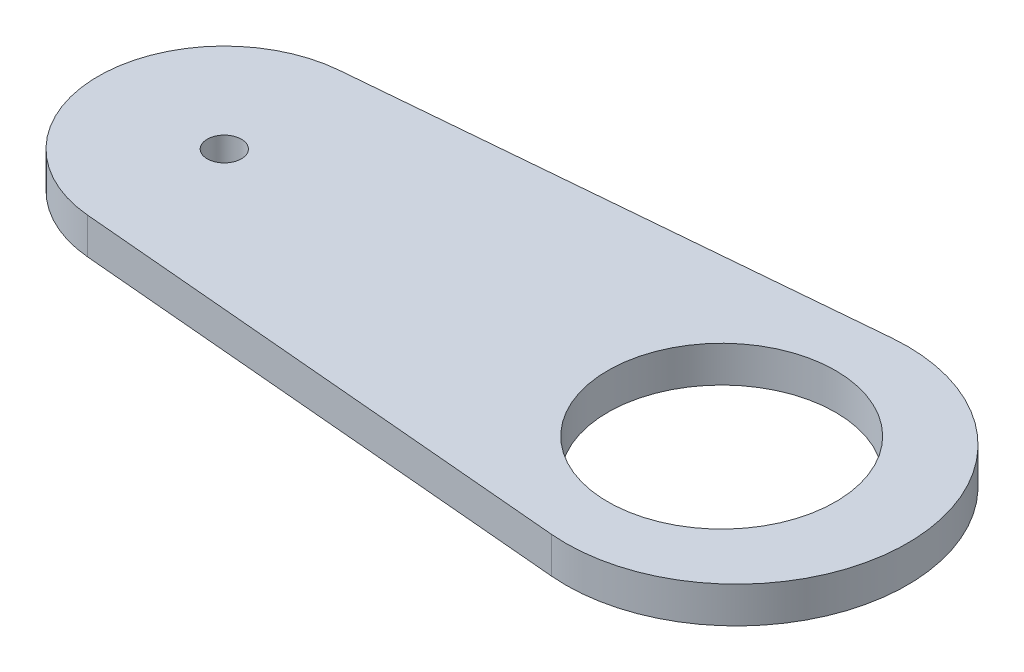
ISO-10303-21;
HEADER;
FILE_DESCRIPTION(('STEP AP214'),'2;1');
FILE_NAME('part.step','',(''),(''),'','','');
FILE_SCHEMA(('AUTOMOTIVE_DESIGN { 1 0 10303 214 1 1 1 1 }'));
ENDSEC;
DATA;
#1=APPLICATION_CONTEXT('core data for automotive mechanical design processes');
#2=APPLICATION_PROTOCOL_DEFINITION('international standard','automotive_design',2000,#1);
#3=PRODUCT_CONTEXT('',#1,'mechanical');
#4=PRODUCT('Part','Part','',(#3));
#5=PRODUCT_RELATED_PRODUCT_CATEGORY('part','',(#4));
#6=PRODUCT_DEFINITION_FORMATION('','',#4);
#7=PRODUCT_DEFINITION_CONTEXT('part definition',#1,'design');
#8=PRODUCT_DEFINITION('design','',#6,#7);
#9=PRODUCT_DEFINITION_SHAPE('','',#8);
#10=(LENGTH_UNIT() NAMED_UNIT(*) SI_UNIT(.MILLI.,.METRE.));
#11=(NAMED_UNIT(*) PLANE_ANGLE_UNIT() SI_UNIT($,.RADIAN.));
#12=(NAMED_UNIT(*) SI_UNIT($,.STERADIAN.) SOLID_ANGLE_UNIT());
#13=UNCERTAINTY_MEASURE_WITH_UNIT(LENGTH_MEASURE(1.E-05),#10,'distance_accuracy_value','');
#14=(GEOMETRIC_REPRESENTATION_CONTEXT(3) GLOBAL_UNCERTAINTY_ASSIGNED_CONTEXT((#13)) GLOBAL_UNIT_ASSIGNED_CONTEXT((#10,
#11,#12)) REPRESENTATION_CONTEXT('',''));
#15=CARTESIAN_POINT('',(0.,0.,0.));
#16=DIRECTION('',(0.,0.,1.));
#17=DIRECTION('',(1.,0.,0.));
#18=AXIS2_PLACEMENT_3D('',#15,#16,#17);
#19=CARTESIAN_POINT('',(-35.984778004175,3.18,0.));
#20=DIRECTION('',(0.,1.,0.));
#21=DIRECTION('',(0.,0.,1.));
#22=AXIS2_PLACEMENT_3D('',#19,#20,#21);
#23=PLANE('',#22);
#24=CARTESIAN_POINT('',(7.70788585461012,3.18,0.));
#25=DIRECTION('',(0.,-1.,0.));
#26=DIRECTION('',(0.,0.,-1.));
#27=AXIS2_PLACEMENT_3D('',#24,#25,#26);
#28=CIRCLE('',#27,10.);
#29=CARTESIAN_POINT('',(7.70788585461012,3.18,-10.));
#30=VERTEX_POINT('',#29);
#31=EDGE_CURVE('E127',#30,#30,#28,.T.);
#32=ORIENTED_EDGE('',*,*,#31,.T.);
#33=EDGE_LOOP('',(#32));
#34=FACE_BOUND('',#33,.T.);
#35=CARTESIAN_POINT('',(-35.984778004175,3.18,0.));
#36=DIRECTION('',(0.,1.,0.));
#37=DIRECTION('',(0.,0.,1.));
#38=AXIS2_PLACEMENT_3D('',#35,#36,#37);
#39=CIRCLE('',#38,11.0779915763554);
#40=CARTESIAN_POINT('',(-36.9502885881646,3.18,-11.0358364738702));
#41=VERTEX_POINT('',#40);
#42=CARTESIAN_POINT('',(-36.9502885881646,3.18,11.0358364738702));
#43=VERTEX_POINT('',#42);
#44=EDGE_CURVE('E98',#41,#43,#39,.T.);
#45=ORIENTED_EDGE('',*,*,#44,.T.);
#46=DIRECTION('',(0.996194698091746,0.,0.0871557427476583));
#47=VECTOR('',#46,1.);
#48=CARTESIAN_POINT('',(-36.9502885881646,3.18,11.0358364738702));
#49=LINE('',#48,#47);
#50=CARTESIAN_POINT('',(7.70788585461013,3.18,14.9429204713762));
#51=VERTEX_POINT('',#50);
#52=EDGE_CURVE('E90',#43,#51,#49,.T.);
#53=ORIENTED_EDGE('',*,*,#52,.T.);
#54=CARTESIAN_POINT('',(9.015221995825,3.18,0.));
#55=DIRECTION('',(0.,-1.,0.));
#56=DIRECTION('',(0.,0.,-1.));
#57=AXIS2_PLACEMENT_3D('',#54,#55,#56);
#58=CIRCLE('',#57,15.);
#59=CARTESIAN_POINT('',(7.70788585461012,3.18,-14.9429204713762));
#60=VERTEX_POINT('',#59);
#61=EDGE_CURVE('E97',#60,#51,#58,.T.);
#62=ORIENTED_EDGE('',*,*,#61,.F.);
#63=DIRECTION('',(0.996194698091746,0.,-0.0871557427476583));
#64=VECTOR('',#63,1.);
#65=CARTESIAN_POINT('',(-36.9502885881646,3.18,-11.0358364738702));
#66=LINE('',#65,#64);
#67=EDGE_CURVE('E107',#41,#60,#66,.T.);
#68=ORIENTED_EDGE('',*,*,#67,.F.);
#69=EDGE_LOOP('',(#45,#53,#62,#68));
#70=FACE_BOUND('',#69,.T.);
#71=CARTESIAN_POINT('',(-35.984778004175,3.18,0.));
#72=DIRECTION('',(0.,1.,0.));
#73=DIRECTION('',(0.,0.,1.));
#74=AXIS2_PLACEMENT_3D('',#71,#72,#73);
#75=CIRCLE('',#74,1.5);
#76=CARTESIAN_POINT('',(-35.984778004175,3.18,-1.5));
#77=VERTEX_POINT('',#76);
#78=EDGE_CURVE('E114',#77,#77,#75,.T.);
#79=ORIENTED_EDGE('',*,*,#78,.F.);
#80=EDGE_LOOP('',(#79));
#81=FACE_BOUND('',#80,.T.);
#82=ADVANCED_FACE('F48',(#34,#70,#81),#23,.T.);
#83=CARTESIAN_POINT('',(-35.984778004175,0.,0.));
#84=DIRECTION('',(0.,1.,0.));
#85=DIRECTION('',(0.,0.,1.));
#86=AXIS2_PLACEMENT_3D('',#83,#84,#85);
#87=PLANE('',#86);
#88=CARTESIAN_POINT('',(7.70788585461012,0.,0.));
#89=DIRECTION('',(0.,-1.,0.));
#90=DIRECTION('',(0.,0.,-1.));
#91=AXIS2_PLACEMENT_3D('',#88,#89,#90);
#92=CIRCLE('',#91,10.);
#93=CARTESIAN_POINT('',(7.70788585461012,0.,-10.));
#94=VERTEX_POINT('',#93);
#95=EDGE_CURVE('E130',#94,#94,#92,.T.);
#96=ORIENTED_EDGE('',*,*,#95,.F.);
#97=EDGE_LOOP('',(#96));
#98=FACE_BOUND('',#97,.T.);
#99=CARTESIAN_POINT('',(-35.984778004175,0.,0.));
#100=DIRECTION('',(0.,1.,0.));
#101=DIRECTION('',(0.,0.,1.));
#102=AXIS2_PLACEMENT_3D('',#99,#100,#101);
#103=CIRCLE('',#102,11.0779915763554);
#104=CARTESIAN_POINT('',(-36.9502885881646,0.,-11.0358364738702));
#105=VERTEX_POINT('',#104);
#106=CARTESIAN_POINT('',(-36.9502885881646,0.,11.0358364738702));
#107=VERTEX_POINT('',#106);
#108=EDGE_CURVE('E112',#105,#107,#103,.T.);
#109=ORIENTED_EDGE('',*,*,#108,.F.);
#110=DIRECTION('',(0.996194698091746,0.,-0.0871557427476583));
#111=VECTOR('',#110,1.);
#112=CARTESIAN_POINT('',(-36.9502885881646,0.,-11.0358364738702));
#113=LINE('',#112,#111);
#114=CARTESIAN_POINT('',(7.70788585461012,0.,-14.9429204713762));
#115=VERTEX_POINT('',#114);
#116=EDGE_CURVE('E118',#105,#115,#113,.T.);
#117=ORIENTED_EDGE('',*,*,#116,.T.);
#118=CARTESIAN_POINT('',(9.015221995825,0.,0.));
#119=DIRECTION('',(0.,-1.,0.));
#120=DIRECTION('',(0.,0.,-1.));
#121=AXIS2_PLACEMENT_3D('',#118,#119,#120);
#122=CIRCLE('',#121,15.);
#123=CARTESIAN_POINT('',(7.70788585461013,0.,14.9429204713762));
#124=VERTEX_POINT('',#123);
#125=EDGE_CURVE('E116',#115,#124,#122,.T.);
#126=ORIENTED_EDGE('',*,*,#125,.T.);
#127=DIRECTION('',(0.996194698091746,0.,0.0871557427476583));
#128=VECTOR('',#127,1.);
#129=CARTESIAN_POINT('',(-36.9502885881646,0.,11.0358364738702));
#130=LINE('',#129,#128);
#131=EDGE_CURVE('E103',#107,#124,#130,.T.);
#132=ORIENTED_EDGE('',*,*,#131,.F.);
#133=EDGE_LOOP('',(#109,#117,#126,#132));
#134=FACE_BOUND('',#133,.T.);
#135=CARTESIAN_POINT('',(-35.984778004175,0.,0.));
#136=DIRECTION('',(0.,1.,0.));
#137=DIRECTION('',(0.,0.,1.));
#138=AXIS2_PLACEMENT_3D('',#135,#136,#137);
#139=CIRCLE('',#138,1.5);
#140=CARTESIAN_POINT('',(-35.984778004175,0.,-1.5));
#141=VERTEX_POINT('',#140);
#142=EDGE_CURVE('E124',#141,#141,#139,.T.);
#143=ORIENTED_EDGE('',*,*,#142,.T.);
#144=EDGE_LOOP('',(#143));
#145=FACE_BOUND('',#144,.T.);
#146=ADVANCED_FACE('F144',(#98,#134,#145),#87,.F.);
#147=CARTESIAN_POINT('',(-35.984778004175,3.18,0.));
#148=DIRECTION('',(0.,-1.,0.));
#149=DIRECTION('',(0.,0.,-1.));
#150=AXIS2_PLACEMENT_3D('',#147,#148,#149);
#151=CYLINDRICAL_SURFACE('',#150,11.0779915763554);
#152=ORIENTED_EDGE('',*,*,#108,.T.);
#153=DIRECTION('',(0.,-1.,0.));
#154=VECTOR('',#153,1.);
#155=CARTESIAN_POINT('',(-36.9502885881646,3.18,11.0358364738702));
#156=LINE('',#155,#154);
#157=EDGE_CURVE('E12',#43,#107,#156,.T.);
#158=ORIENTED_EDGE('',*,*,#157,.F.);
#159=ORIENTED_EDGE('',*,*,#44,.F.);
#160=DIRECTION('',(0.,-1.,0.));
#161=VECTOR('',#160,1.);
#162=CARTESIAN_POINT('',(-36.9502885881646,3.18,-11.0358364738702));
#163=LINE('',#162,#161);
#164=EDGE_CURVE('E65',#41,#105,#163,.T.);
#165=ORIENTED_EDGE('',*,*,#164,.T.);
#166=EDGE_LOOP('',(#152,#158,#159,#165));
#167=FACE_BOUND('',#166,.T.);
#168=ADVANCED_FACE('F50',(#167),#151,.T.);
#169=CARTESIAN_POINT('',(-36.9502885881646,3.18,11.0358364738702));
#170=DIRECTION('',(0.0871557427476583,0.,-0.996194698091746));
#171=DIRECTION('',(-0.996194698091746,0.,-0.0871557427476583));
#172=AXIS2_PLACEMENT_3D('',#169,#170,#171);
#173=PLANE('',#172);
#174=ORIENTED_EDGE('',*,*,#131,.T.);
#175=DIRECTION('',(0.,-1.,0.));
#176=VECTOR('',#175,1.);
#177=CARTESIAN_POINT('',(7.70788585461013,3.18,14.9429204713762));
#178=LINE('',#177,#176);
#179=EDGE_CURVE('E57',#51,#124,#178,.T.);
#180=ORIENTED_EDGE('',*,*,#179,.F.);
#181=ORIENTED_EDGE('',*,*,#52,.F.);
#182=ORIENTED_EDGE('',*,*,#157,.T.);
#183=EDGE_LOOP('',(#174,#180,#181,#182));
#184=FACE_BOUND('',#183,.T.);
#185=ADVANCED_FACE('F102',(#184),#173,.F.);
#186=CARTESIAN_POINT('',(9.015221995825,3.18,0.));
#187=DIRECTION('',(0.,-1.,0.));
#188=DIRECTION('',(0.,0.,-1.));
#189=AXIS2_PLACEMENT_3D('',#186,#187,#188);
#190=CYLINDRICAL_SURFACE('',#189,15.);
#191=ORIENTED_EDGE('',*,*,#125,.F.);
#192=DIRECTION('',(0.,-1.,0.));
#193=VECTOR('',#192,1.);
#194=CARTESIAN_POINT('',(7.70788585461012,3.18,-14.9429204713762));
#195=LINE('',#194,#193);
#196=EDGE_CURVE('E79',#60,#115,#195,.T.);
#197=ORIENTED_EDGE('',*,*,#196,.F.);
#198=ORIENTED_EDGE('',*,*,#61,.T.);
#199=ORIENTED_EDGE('',*,*,#179,.T.);
#200=EDGE_LOOP('',(#191,#197,#198,#199));
#201=FACE_BOUND('',#200,.T.);
#202=ADVANCED_FACE('F106',(#201),#190,.T.);
#203=CARTESIAN_POINT('',(-36.9502885881646,3.18,-11.0358364738702));
#204=DIRECTION('',(-0.0871557427476583,0.,-0.996194698091746));
#205=DIRECTION('',(-0.996194698091746,0.,0.0871557427476583));
#206=AXIS2_PLACEMENT_3D('',#203,#204,#205);
#207=PLANE('',#206);
#208=ORIENTED_EDGE('',*,*,#116,.F.);
#209=ORIENTED_EDGE('',*,*,#164,.F.);
#210=ORIENTED_EDGE('',*,*,#67,.T.);
#211=ORIENTED_EDGE('',*,*,#196,.T.);
#212=EDGE_LOOP('',(#208,#209,#210,#211));
#213=FACE_BOUND('',#212,.T.);
#214=ADVANCED_FACE('F151',(#213),#207,.T.);
#215=CARTESIAN_POINT('',(-35.984778004175,3.18,0.));
#216=DIRECTION('',(0.,-1.,0.));
#217=DIRECTION('',(0.,0.,-1.));
#218=AXIS2_PLACEMENT_3D('',#215,#216,#217);
#219=CYLINDRICAL_SURFACE('',#218,1.5);
#220=CARTESIAN_POINT('',(-35.984778004175,3.18,-1.5));
#221=CARTESIAN_POINT('',(-35.984778004175,3.146875,-1.5));
#222=CARTESIAN_POINT('',(-35.984778004175,3.11375,-1.5));
#223=CARTESIAN_POINT('',(-35.984778004175,3.0475,-1.5));
#224=CARTESIAN_POINT('',(-35.984778004175,3.014375,-1.5));
#225=CARTESIAN_POINT('',(-35.984778004175,2.948125,-1.5));
#226=CARTESIAN_POINT('',(-35.984778004175,2.915,-1.5));
#227=CARTESIAN_POINT('',(-35.984778004175,2.84875,-1.5));
#228=CARTESIAN_POINT('',(-35.984778004175,2.815625,-1.5));
#229=CARTESIAN_POINT('',(-35.984778004175,2.749375,-1.5));
#230=CARTESIAN_POINT('',(-35.984778004175,2.71625,-1.5));
#231=CARTESIAN_POINT('',(-35.984778004175,2.65,-1.5));
#232=CARTESIAN_POINT('',(-35.984778004175,2.616875,-1.5));
#233=CARTESIAN_POINT('',(-35.984778004175,2.550625,-1.5));
#234=CARTESIAN_POINT('',(-35.984778004175,2.5175,-1.5));
#235=CARTESIAN_POINT('',(-35.984778004175,2.45125,-1.5));
#236=CARTESIAN_POINT('',(-35.984778004175,2.418125,-1.5));
#237=CARTESIAN_POINT('',(-35.984778004175,2.351875,-1.5));
#238=CARTESIAN_POINT('',(-35.984778004175,2.31875,-1.5));
#239=CARTESIAN_POINT('',(-35.984778004175,2.2525,-1.5));
#240=CARTESIAN_POINT('',(-35.984778004175,2.219375,-1.5));
#241=CARTESIAN_POINT('',(-35.984778004175,2.153125,-1.5));
#242=CARTESIAN_POINT('',(-35.984778004175,2.12,-1.5));
#243=CARTESIAN_POINT('',(-35.984778004175,2.05375,-1.5));
#244=CARTESIAN_POINT('',(-35.984778004175,2.020625,-1.5));
#245=CARTESIAN_POINT('',(-35.984778004175,1.954375,-1.5));
#246=CARTESIAN_POINT('',(-35.984778004175,1.92125,-1.5));
#247=CARTESIAN_POINT('',(-35.984778004175,1.855,-1.5));
#248=CARTESIAN_POINT('',(-35.984778004175,1.821875,-1.5));
#249=CARTESIAN_POINT('',(-35.984778004175,1.755625,-1.5));
#250=CARTESIAN_POINT('',(-35.984778004175,1.7225,-1.5));
#251=CARTESIAN_POINT('',(-35.984778004175,1.65625,-1.5));
#252=CARTESIAN_POINT('',(-35.984778004175,1.623125,-1.5));
#253=CARTESIAN_POINT('',(-35.984778004175,1.556875,-1.5));
#254=CARTESIAN_POINT('',(-35.984778004175,1.52375,-1.5));
#255=CARTESIAN_POINT('',(-35.984778004175,1.4575,-1.5));
#256=CARTESIAN_POINT('',(-35.984778004175,1.424375,-1.5));
#257=CARTESIAN_POINT('',(-35.984778004175,1.358125,-1.5));
#258=CARTESIAN_POINT('',(-35.984778004175,1.325,-1.5));
#259=CARTESIAN_POINT('',(-35.984778004175,1.25875,-1.5));
#260=CARTESIAN_POINT('',(-35.984778004175,1.225625,-1.5));
#261=CARTESIAN_POINT('',(-35.984778004175,1.159375,-1.5));
#262=CARTESIAN_POINT('',(-35.984778004175,1.12625,-1.5));
#263=CARTESIAN_POINT('',(-35.984778004175,1.06,-1.5));
#264=CARTESIAN_POINT('',(-35.984778004175,1.026875,-1.5));
#265=CARTESIAN_POINT('',(-35.984778004175,0.960625,-1.5));
#266=CARTESIAN_POINT('',(-35.984778004175,0.9275,-1.5));
#267=CARTESIAN_POINT('',(-35.984778004175,0.86125,-1.5));
#268=CARTESIAN_POINT('',(-35.984778004175,0.828125,-1.5));
#269=CARTESIAN_POINT('',(-35.984778004175,0.761875,-1.5));
#270=CARTESIAN_POINT('',(-35.984778004175,0.72875,-1.5));
#271=CARTESIAN_POINT('',(-35.984778004175,0.6625,-1.5));
#272=CARTESIAN_POINT('',(-35.984778004175,0.629375,-1.5));
#273=CARTESIAN_POINT('',(-35.984778004175,0.563125,-1.5));
#274=CARTESIAN_POINT('',(-35.984778004175,0.53,-1.5));
#275=CARTESIAN_POINT('',(-35.984778004175,0.46375,-1.5));
#276=CARTESIAN_POINT('',(-35.984778004175,0.430625,-1.5));
#277=CARTESIAN_POINT('',(-35.984778004175,0.364375,-1.5));
#278=CARTESIAN_POINT('',(-35.984778004175,0.33125,-1.5));
#279=CARTESIAN_POINT('',(-35.984778004175,0.265,-1.5));
#280=CARTESIAN_POINT('',(-35.984778004175,0.231875,-1.5));
#281=CARTESIAN_POINT('',(-35.984778004175,0.165625,-1.5));
#282=CARTESIAN_POINT('',(-35.984778004175,0.1325,-1.5));
#283=CARTESIAN_POINT('',(-35.984778004175,0.06625,-1.5));
#284=CARTESIAN_POINT('',(-35.984778004175,0.033125,-1.5));
#285=CARTESIAN_POINT('',(-35.984778004175,0.,-1.5));
#286=B_SPLINE_CURVE_WITH_KNOTS('',3,(#220,#221,#222,#223,#224,#225,#226,#227,#228,#229,#230,
#231,#232,#233,#234,#235,#236,#237,#238,#239,#240,#241,#242,#243,#244,#245,#246,#247,#248,#249,
#250,#251,#252,#253,#254,#255,#256,#257,#258,#259,#260,#261,#262,#263,#264,#265,#266,#267,#268,
#269,#270,#271,#272,#273,#274,#275,#276,#277,#278,#279,#280,#281,#282,#283,#284,#285),
.UNSPECIFIED.,.F.,.F.,(4,2,2,2,2,2,2,2,2,2,2,2,2,2,2,2,2,2,2,2,2,2,2,2,2,2,2,2,2,2,2,2,4),(0.,
0.0993749999999996,0.19875,0.298125,0.3975,0.496875,0.59625,0.695625,0.795,0.894375,0.99375,
1.093125,1.1925,1.291875,1.39125,1.490625,1.59,1.689375,1.78875,1.888125,1.9875,2.086875,
2.18625,2.285625,2.385,2.484375,2.58375,2.683125,2.7825,2.881875,2.98125,3.080625,3.18),.UNSPECIFIED.);
#287=EDGE_CURVE('BSEAM140',#77,#141,#286,.T.);
#288=ORIENTED_EDGE('',*,*,#78,.T.);
#289=ORIENTED_EDGE('',*,*,#142,.F.);
#290=ORIENTED_EDGE('',*,*,#287,.T.);
#291=ORIENTED_EDGE('',*,*,#287,.F.);
#292=EDGE_LOOP('',(#288,#290,#289,#291));
#293=FACE_BOUND('',#292,.T.);
#294=ADVANCED_FACE('F140',(#293),#219,.F.);
#295=CARTESIAN_POINT('',(7.70788585461012,3.18,0.));
#296=DIRECTION('',(0.,-1.,0.));
#297=DIRECTION('',(0.,0.,-1.));
#298=AXIS2_PLACEMENT_3D('',#295,#296,#297);
#299=CYLINDRICAL_SURFACE('',#298,10.);
#300=CARTESIAN_POINT('',(7.70788585461012,3.18,-10.));
#301=CARTESIAN_POINT('',(7.70788585461012,3.146875,-10.));
#302=CARTESIAN_POINT('',(7.70788585461012,3.11375,-10.));
#303=CARTESIAN_POINT('',(7.70788585461012,3.0475,-10.));
#304=CARTESIAN_POINT('',(7.70788585461012,3.014375,-10.));
#305=CARTESIAN_POINT('',(7.70788585461012,2.948125,-10.));
#306=CARTESIAN_POINT('',(7.70788585461012,2.915,-10.));
#307=CARTESIAN_POINT('',(7.70788585461012,2.84875,-10.));
#308=CARTESIAN_POINT('',(7.70788585461012,2.815625,-10.));
#309=CARTESIAN_POINT('',(7.70788585461012,2.749375,-10.));
#310=CARTESIAN_POINT('',(7.70788585461012,2.71625,-10.));
#311=CARTESIAN_POINT('',(7.70788585461012,2.65,-10.));
#312=CARTESIAN_POINT('',(7.70788585461012,2.616875,-10.));
#313=CARTESIAN_POINT('',(7.70788585461012,2.550625,-10.));
#314=CARTESIAN_POINT('',(7.70788585461012,2.5175,-10.));
#315=CARTESIAN_POINT('',(7.70788585461012,2.45125,-10.));
#316=CARTESIAN_POINT('',(7.70788585461012,2.418125,-10.));
#317=CARTESIAN_POINT('',(7.70788585461012,2.351875,-10.));
#318=CARTESIAN_POINT('',(7.70788585461012,2.31875,-10.));
#319=CARTESIAN_POINT('',(7.70788585461012,2.2525,-10.));
#320=CARTESIAN_POINT('',(7.70788585461012,2.219375,-10.));
#321=CARTESIAN_POINT('',(7.70788585461012,2.153125,-10.));
#322=CARTESIAN_POINT('',(7.70788585461012,2.12,-10.));
#323=CARTESIAN_POINT('',(7.70788585461012,2.05375,-10.));
#324=CARTESIAN_POINT('',(7.70788585461012,2.020625,-10.));
#325=CARTESIAN_POINT('',(7.70788585461012,1.954375,-10.));
#326=CARTESIAN_POINT('',(7.70788585461012,1.92125,-10.));
#327=CARTESIAN_POINT('',(7.70788585461012,1.855,-10.));
#328=CARTESIAN_POINT('',(7.70788585461012,1.821875,-10.));
#329=CARTESIAN_POINT('',(7.70788585461012,1.755625,-10.));
#330=CARTESIAN_POINT('',(7.70788585461012,1.7225,-10.));
#331=CARTESIAN_POINT('',(7.70788585461012,1.65625,-10.));
#332=CARTESIAN_POINT('',(7.70788585461012,1.623125,-10.));
#333=CARTESIAN_POINT('',(7.70788585461012,1.556875,-10.));
#334=CARTESIAN_POINT('',(7.70788585461012,1.52375,-10.));
#335=CARTESIAN_POINT('',(7.70788585461012,1.4575,-10.));
#336=CARTESIAN_POINT('',(7.70788585461012,1.424375,-10.));
#337=CARTESIAN_POINT('',(7.70788585461012,1.358125,-10.));
#338=CARTESIAN_POINT('',(7.70788585461012,1.325,-10.));
#339=CARTESIAN_POINT('',(7.70788585461012,1.25875,-10.));
#340=CARTESIAN_POINT('',(7.70788585461012,1.225625,-10.));
#341=CARTESIAN_POINT('',(7.70788585461012,1.159375,-10.));
#342=CARTESIAN_POINT('',(7.70788585461012,1.12625,-10.));
#343=CARTESIAN_POINT('',(7.70788585461012,1.06,-10.));
#344=CARTESIAN_POINT('',(7.70788585461012,1.026875,-10.));
#345=CARTESIAN_POINT('',(7.70788585461012,0.960625,-10.));
#346=CARTESIAN_POINT('',(7.70788585461012,0.9275,-10.));
#347=CARTESIAN_POINT('',(7.70788585461012,0.86125,-10.));
#348=CARTESIAN_POINT('',(7.70788585461012,0.828125,-10.));
#349=CARTESIAN_POINT('',(7.70788585461012,0.761875,-10.));
#350=CARTESIAN_POINT('',(7.70788585461012,0.72875,-10.));
#351=CARTESIAN_POINT('',(7.70788585461012,0.6625,-10.));
#352=CARTESIAN_POINT('',(7.70788585461012,0.629375,-10.));
#353=CARTESIAN_POINT('',(7.70788585461012,0.563125,-10.));
#354=CARTESIAN_POINT('',(7.70788585461012,0.53,-10.));
#355=CARTESIAN_POINT('',(7.70788585461012,0.46375,-10.));
#356=CARTESIAN_POINT('',(7.70788585461012,0.430625,-10.));
#357=CARTESIAN_POINT('',(7.70788585461012,0.364375,-10.));
#358=CARTESIAN_POINT('',(7.70788585461012,0.33125,-10.));
#359=CARTESIAN_POINT('',(7.70788585461012,0.265,-10.));
#360=CARTESIAN_POINT('',(7.70788585461012,0.231875,-10.));
#361=CARTESIAN_POINT('',(7.70788585461012,0.165625,-10.));
#362=CARTESIAN_POINT('',(7.70788585461012,0.1325,-10.));
#363=CARTESIAN_POINT('',(7.70788585461012,0.06625,-10.));
#364=CARTESIAN_POINT('',(7.70788585461012,0.033125,-10.));
#365=CARTESIAN_POINT('',(7.70788585461012,0.,-10.));
#366=B_SPLINE_CURVE_WITH_KNOTS('',3,(#300,#301,#302,#303,#304,#305,#306,#307,#308,#309,#310,
#311,#312,#313,#314,#315,#316,#317,#318,#319,#320,#321,#322,#323,#324,#325,#326,#327,#328,#329,
#330,#331,#332,#333,#334,#335,#336,#337,#338,#339,#340,#341,#342,#343,#344,#345,#346,#347,#348,
#349,#350,#351,#352,#353,#354,#355,#356,#357,#358,#359,#360,#361,#362,#363,#364,#365),
.UNSPECIFIED.,.F.,.F.,(4,2,2,2,2,2,2,2,2,2,2,2,2,2,2,2,2,2,2,2,2,2,2,2,2,2,2,2,2,2,2,2,4),(0.,
0.0993749999999996,0.19875,0.298125,0.3975,0.496875,0.59625,0.695625,0.795,0.894375,0.99375,
1.093125,1.1925,1.291875,1.39125,1.490625,1.59,1.689375,1.78875,1.888125,1.9875,2.086875,
2.18625,2.285625,2.385,2.484375,2.58375,2.683125,2.7825,2.881875,2.98125,3.080625,3.18),.UNSPECIFIED.);
#367=EDGE_CURVE('BSEAM137',#30,#94,#366,.T.);
#368=ORIENTED_EDGE('',*,*,#31,.F.);
#369=ORIENTED_EDGE('',*,*,#95,.T.);
#370=ORIENTED_EDGE('',*,*,#367,.T.);
#371=ORIENTED_EDGE('',*,*,#367,.F.);
#372=EDGE_LOOP('',(#368,#370,#369,#371));
#373=FACE_BOUND('',#372,.T.);
#374=ADVANCED_FACE('F137',(#373),#299,.F.);
#375=CLOSED_SHELL('',(#82,#146,#168,#185,#202,#214,#294,#374));
#376=MANIFOLD_SOLID_BREP('B2',#375);
#377=ADVANCED_BREP_SHAPE_REPRESENTATION('',(#18,#376),#14);
#378=SHAPE_DEFINITION_REPRESENTATION(#9,#377);
ENDSEC;
END-ISO-10303-21;
